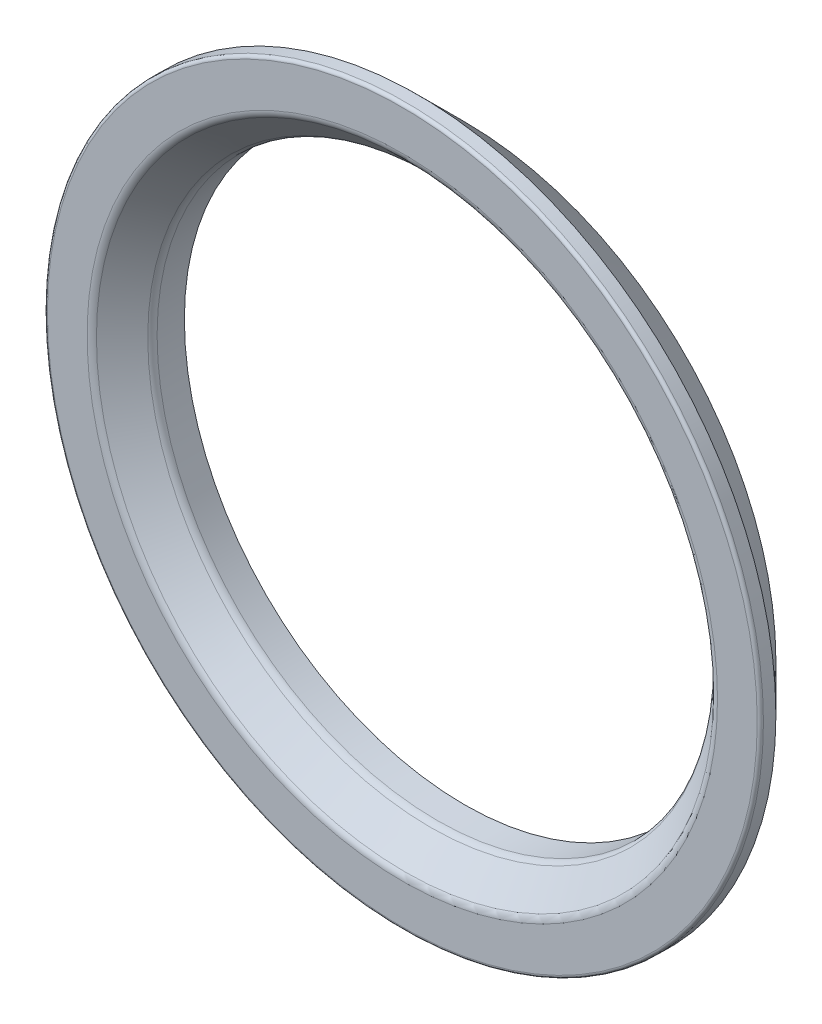
ISO-10303-21;
HEADER;
FILE_DESCRIPTION(('STEP AP214'),'2;1');
FILE_NAME('part.step','',(''),(''),'','','');
FILE_SCHEMA(('AUTOMOTIVE_DESIGN { 1 0 10303 214 1 1 1 1 }'));
ENDSEC;
DATA;
#1=APPLICATION_CONTEXT('core data for automotive mechanical design processes');
#2=APPLICATION_PROTOCOL_DEFINITION('international standard','automotive_design',2000,#1);
#3=PRODUCT_CONTEXT('',#1,'mechanical');
#4=PRODUCT('Part','Part','',(#3));
#5=PRODUCT_RELATED_PRODUCT_CATEGORY('part','',(#4));
#6=PRODUCT_DEFINITION_FORMATION('','',#4);
#7=PRODUCT_DEFINITION_CONTEXT('part definition',#1,'design');
#8=PRODUCT_DEFINITION('design','',#6,#7);
#9=PRODUCT_DEFINITION_SHAPE('','',#8);
#10=(LENGTH_UNIT() NAMED_UNIT(*) SI_UNIT(.MILLI.,.METRE.));
#11=(NAMED_UNIT(*) PLANE_ANGLE_UNIT() SI_UNIT($,.RADIAN.));
#12=(NAMED_UNIT(*) SI_UNIT($,.STERADIAN.) SOLID_ANGLE_UNIT());
#13=UNCERTAINTY_MEASURE_WITH_UNIT(LENGTH_MEASURE(1.E-05),#10,'distance_accuracy_value','');
#14=(GEOMETRIC_REPRESENTATION_CONTEXT(3) GLOBAL_UNCERTAINTY_ASSIGNED_CONTEXT((#13)) GLOBAL_UNIT_ASSIGNED_CONTEXT((#10,
#11,#12)) REPRESENTATION_CONTEXT('',''));
#15=CARTESIAN_POINT('',(0.,0.,0.));
#16=DIRECTION('',(0.,0.,1.));
#17=DIRECTION('',(1.,0.,0.));
#18=AXIS2_PLACEMENT_3D('',#15,#16,#17);
#19=CARTESIAN_POINT('',(0.,0.,2.));
#20=DIRECTION('',(0.,0.,-1.));
#21=DIRECTION('',(-1.,0.,0.));
#22=AXIS2_PLACEMENT_3D('',#19,#20,#21);
#23=CYLINDRICAL_SURFACE('',#22,11.5);
#24=CARTESIAN_POINT('',(0.,0.,1.9));
#25=DIRECTION('',(0.,0.,1.));
#26=DIRECTION('',(1.,0.,0.));
#27=AXIS2_PLACEMENT_3D('',#24,#25,#26);
#28=CIRCLE('',#27,11.5);
#29=CARTESIAN_POINT('',(11.5,0.,1.9));
#30=VERTEX_POINT('',#29);
#31=EDGE_CURVE('E10',#30,#30,#28,.F.);
#32=ORIENTED_EDGE('',*,*,#31,.T.);
#33=EDGE_LOOP('',(#32));
#34=FACE_BOUND('',#33,.T.);
#35=CARTESIAN_POINT('',(0.,0.,1.5));
#36=DIRECTION('',(0.,0.,1.));
#37=DIRECTION('',(1.,0.,0.));
#38=AXIS2_PLACEMENT_3D('',#35,#36,#37);
#39=CIRCLE('',#38,11.5);
#40=CARTESIAN_POINT('',(11.5,0.,1.5));
#41=VERTEX_POINT('',#40);
#42=EDGE_CURVE('E67',#41,#41,#39,.T.);
#43=ORIENTED_EDGE('',*,*,#42,.T.);
#44=EDGE_LOOP('',(#43));
#45=FACE_BOUND('',#44,.T.);
#46=ADVANCED_FACE('F39',(#34,#45),#23,.T.);
#47=CARTESIAN_POINT('',(0.,0.,2.));
#48=DIRECTION('',(0.,0.,1.));
#49=DIRECTION('',(1.,0.,0.));
#50=AXIS2_PLACEMENT_3D('',#47,#48,#49);
#51=PLANE('',#50);
#52=CARTESIAN_POINT('',(0.,0.,2.));
#53=DIRECTION('',(0.,0.,1.));
#54=DIRECTION('',(1.,0.,0.));
#55=AXIS2_PLACEMENT_3D('',#52,#53,#54);
#56=CIRCLE('',#55,11.4);
#57=CARTESIAN_POINT('',(11.4,0.,2.));
#58=VERTEX_POINT('',#57);
#59=EDGE_CURVE('E46',#58,#58,#56,.T.);
#60=ORIENTED_EDGE('',*,*,#59,.T.);
#61=EDGE_LOOP('',(#60));
#62=FACE_BOUND('',#61,.T.);
#63=CARTESIAN_POINT('',(0.,0.,2.));
#64=DIRECTION('',(0.,0.,1.));
#65=DIRECTION('',(1.,0.,0.));
#66=AXIS2_PLACEMENT_3D('',#63,#64,#65);
#67=CIRCLE('',#66,10.1242640687119);
#68=CARTESIAN_POINT('',(10.1242640687119,0.,2.));
#69=VERTEX_POINT('',#68);
#70=EDGE_CURVE('E65',#69,#69,#67,.F.);
#71=ORIENTED_EDGE('',*,*,#70,.T.);
#72=EDGE_LOOP('',(#71));
#73=FACE_BOUND('',#72,.T.);
#74=ADVANCED_FACE('F96',(#62,#73),#51,.T.);
#75=CARTESIAN_POINT('',(0.,0.,0.));
#76=DIRECTION('',(0.,0.,1.));
#77=DIRECTION('',(1.,0.,0.));
#78=AXIS2_PLACEMENT_3D('',#75,#76,#77);
#79=PLANE('',#78);
#80=CARTESIAN_POINT('',(0.,0.,0.));
#81=DIRECTION('',(0.,0.,1.));
#82=DIRECTION('',(1.,0.,0.));
#83=AXIS2_PLACEMENT_3D('',#80,#81,#82);
#84=CIRCLE('',#83,9.);
#85=CARTESIAN_POINT('',(9.,0.,0.));
#86=VERTEX_POINT('',#85);
#87=EDGE_CURVE('E72',#86,#86,#84,.T.);
#88=ORIENTED_EDGE('',*,*,#87,.T.);
#89=EDGE_LOOP('',(#88));
#90=FACE_BOUND('',#89,.T.);
#91=CARTESIAN_POINT('',(0.,0.,0.));
#92=DIRECTION('',(0.,0.,1.));
#93=DIRECTION('',(1.,0.,0.));
#94=AXIS2_PLACEMENT_3D('',#91,#92,#93);
#95=CIRCLE('',#94,9.99999999999999);
#96=CARTESIAN_POINT('',(9.99999999999999,0.,0.));
#97=VERTEX_POINT('',#96);
#98=EDGE_CURVE('E62',#97,#97,#95,.F.);
#99=ORIENTED_EDGE('',*,*,#98,.T.);
#100=EDGE_LOOP('',(#99));
#101=FACE_BOUND('',#100,.T.);
#102=ADVANCED_FACE('F73',(#90,#101),#79,.F.);
#103=CARTESIAN_POINT('',(0.,0.,1.5));
#104=DIRECTION('',(0.,0.,1.));
#105=DIRECTION('',(1.,0.,0.));
#106=AXIS2_PLACEMENT_3D('',#103,#104,#105);
#107=CONICAL_SURFACE('',#106,11.5,0.785398163397451);
#108=ORIENTED_EDGE('',*,*,#98,.F.);
#109=EDGE_LOOP('',(#108));
#110=FACE_BOUND('',#109,.T.);
#111=ORIENTED_EDGE('',*,*,#42,.F.);
#112=EDGE_LOOP('',(#111));
#113=FACE_BOUND('',#112,.T.);
#114=ADVANCED_FACE('F81',(#110,#113),#107,.T.);
#115=CARTESIAN_POINT('',(0.,0.,0.));
#116=DIRECTION('',(0.,0.,1.));
#117=DIRECTION('',(1.,0.,0.));
#118=AXIS2_PLACEMENT_3D('',#115,#116,#117);
#119=CYLINDRICAL_SURFACE('',#118,9.);
#120=CARTESIAN_POINT('',(0.,0.,0.875735931288065));
#121=DIRECTION('',(0.,0.,-1.));
#122=DIRECTION('',(-1.,0.,0.));
#123=AXIS2_PLACEMENT_3D('',#120,#121,#122);
#124=CIRCLE('',#123,9.);
#125=CARTESIAN_POINT('',(-9.,0.,0.875735931288065));
#126=VERTEX_POINT('',#125);
#127=EDGE_CURVE('E49',#126,#126,#124,.F.);
#128=ORIENTED_EDGE('',*,*,#127,.T.);
#129=EDGE_LOOP('',(#128));
#130=FACE_BOUND('',#129,.T.);
#131=ORIENTED_EDGE('',*,*,#87,.F.);
#132=EDGE_LOOP('',(#131));
#133=FACE_BOUND('',#132,.T.);
#134=ADVANCED_FACE('F76',(#130,#133),#119,.F.);
#135=CARTESIAN_POINT('',(0.,0.,0.999999999999994));
#136=DIRECTION('',(0.,0.,1.));
#137=DIRECTION('',(1.,0.,0.));
#138=AXIS2_PLACEMENT_3D('',#135,#136,#137);
#139=CONICAL_SURFACE('',#138,9.,0.785398163397453);
#140=CARTESIAN_POINT('',(0.,0.,1.91213203435597));
#141=DIRECTION('',(0.,0.,-1.));
#142=DIRECTION('',(-1.,0.,0.));
#143=AXIS2_PLACEMENT_3D('',#140,#141,#142);
#144=CIRCLE('',#143,9.91213203435598);
#145=CARTESIAN_POINT('',(-9.91213203435598,0.,1.91213203435597));
#146=VERTEX_POINT('',#145);
#147=EDGE_CURVE('E53',#146,#146,#144,.F.);
#148=ORIENTED_EDGE('',*,*,#147,.T.);
#149=EDGE_LOOP('',(#148));
#150=FACE_BOUND('',#149,.T.);
#151=CARTESIAN_POINT('',(0.,0.,1.08786796564403));
#152=DIRECTION('',(0.,0.,1.));
#153=DIRECTION('',(1.,0.,0.));
#154=AXIS2_PLACEMENT_3D('',#151,#152,#153);
#155=CIRCLE('',#154,9.08786796564404);
#156=CARTESIAN_POINT('',(9.08786796564404,0.,1.08786796564403));
#157=VERTEX_POINT('',#156);
#158=EDGE_CURVE('E56',#157,#157,#155,.F.);
#159=ORIENTED_EDGE('',*,*,#158,.T.);
#160=EDGE_LOOP('',(#159));
#161=FACE_BOUND('',#160,.T.);
#162=ADVANCED_FACE('F77',(#150,#161),#139,.F.);
#163=CARTESIAN_POINT('',(0.,0.,1.7));
#164=DIRECTION('',(0.,0.,1.));
#165=DIRECTION('',(1.,0.,0.));
#166=AXIS2_PLACEMENT_3D('',#163,#164,#165);
#167=TOROIDAL_SURFACE('',#166,10.1242640687119,0.3);
#168=ORIENTED_EDGE('',*,*,#147,.F.);
#169=EDGE_LOOP('',(#168));
#170=FACE_BOUND('',#169,.T.);
#171=ORIENTED_EDGE('',*,*,#70,.F.);
#172=EDGE_LOOP('',(#171));
#173=FACE_BOUND('',#172,.T.);
#174=ADVANCED_FACE('F86',(#170,#173),#167,.T.);
#175=CARTESIAN_POINT('',(0.,0.,0.875735931288065));
#176=DIRECTION('',(0.,0.,-1.));
#177=DIRECTION('',(-1.,0.,0.));
#178=AXIS2_PLACEMENT_3D('',#175,#176,#177);
#179=TOROIDAL_SURFACE('',#178,9.3,0.3);
#180=ORIENTED_EDGE('',*,*,#158,.F.);
#181=EDGE_LOOP('',(#180));
#182=FACE_BOUND('',#181,.T.);
#183=ORIENTED_EDGE('',*,*,#127,.F.);
#184=EDGE_LOOP('',(#183));
#185=FACE_BOUND('',#184,.T.);
#186=ADVANCED_FACE('F115',(#182,#185),#179,.T.);
#187=CARTESIAN_POINT('',(0.,0.,1.9));
#188=DIRECTION('',(0.,0.,1.));
#189=DIRECTION('',(1.,0.,0.));
#190=AXIS2_PLACEMENT_3D('',#187,#188,#189);
#191=TOROIDAL_SURFACE('',#190,11.4,0.1);
#192=ORIENTED_EDGE('',*,*,#31,.F.);
#193=EDGE_LOOP('',(#192));
#194=FACE_BOUND('',#193,.T.);
#195=ORIENTED_EDGE('',*,*,#59,.F.);
#196=EDGE_LOOP('',(#195));
#197=FACE_BOUND('',#196,.T.);
#198=ADVANCED_FACE('F41',(#194,#197),#191,.T.);
#199=CLOSED_SHELL('',(#46,#74,#102,#114,#134,#162,#174,#186,#198));
#200=MANIFOLD_SOLID_BREP('B2',#199);
#201=ADVANCED_BREP_SHAPE_REPRESENTATION('',(#18,#200),#14);
#202=SHAPE_DEFINITION_REPRESENTATION(#9,#201);
ENDSEC;
END-ISO-10303-21;
